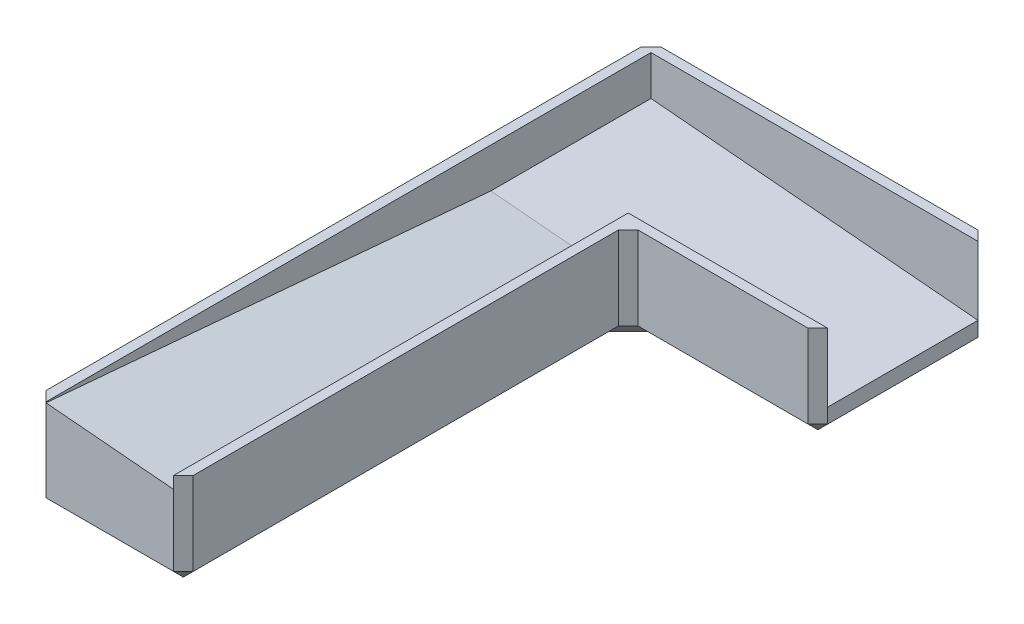
ISO-10303-21;
HEADER;
FILE_DESCRIPTION(('STEP AP214'),'2;1');
FILE_NAME('part.step','',(''),(''),'','','');
FILE_SCHEMA(('AUTOMOTIVE_DESIGN { 1 0 10303 214 1 1 1 1 }'));
ENDSEC;
DATA;
#1=APPLICATION_CONTEXT('core data for automotive mechanical design processes');
#2=APPLICATION_PROTOCOL_DEFINITION('international standard','automotive_design',2000,#1);
#3=PRODUCT_CONTEXT('',#1,'mechanical');
#4=PRODUCT('Part','Part','',(#3));
#5=PRODUCT_RELATED_PRODUCT_CATEGORY('part','',(#4));
#6=PRODUCT_DEFINITION_FORMATION('','',#4);
#7=PRODUCT_DEFINITION_CONTEXT('part definition',#1,'design');
#8=PRODUCT_DEFINITION('design','',#6,#7);
#9=PRODUCT_DEFINITION_SHAPE('','',#8);
#10=(LENGTH_UNIT() NAMED_UNIT(*) SI_UNIT(.MILLI.,.METRE.));
#11=(NAMED_UNIT(*) PLANE_ANGLE_UNIT() SI_UNIT($,.RADIAN.));
#12=(NAMED_UNIT(*) SI_UNIT($,.STERADIAN.) SOLID_ANGLE_UNIT());
#13=UNCERTAINTY_MEASURE_WITH_UNIT(LENGTH_MEASURE(1.E-05),#10,'distance_accuracy_value','');
#14=(GEOMETRIC_REPRESENTATION_CONTEXT(3) GLOBAL_UNCERTAINTY_ASSIGNED_CONTEXT((#13)) GLOBAL_UNIT_ASSIGNED_CONTEXT((#10,
#11,#12)) REPRESENTATION_CONTEXT('',''));
#15=CARTESIAN_POINT('',(0.,0.,0.));
#16=DIRECTION('',(0.,0.,1.));
#17=DIRECTION('',(1.,0.,0.));
#18=AXIS2_PLACEMENT_3D('',#15,#16,#17);
#19=CARTESIAN_POINT('',(-0.874258781512864,-25.,0.));
#20=DIRECTION('',(1.,0.,0.));
#21=DIRECTION('',(0.,0.,-1.));
#22=AXIS2_PLACEMENT_3D('',#19,#20,#21);
#23=PLANE('',#22);
#24=DIRECTION('',(0.,0.,1.));
#25=VECTOR('',#24,1.);
#26=CARTESIAN_POINT('',(-0.874258781512545,-6.06088532495046,62.6555080756908));
#27=LINE('',#26,#25);
#28=CARTESIAN_POINT('',(-0.874258781512857,-6.06088532495046,-26.0144919243134));
#29=VERTEX_POINT('',#28);
#30=CARTESIAN_POINT('',(-0.874258781512552,-6.06088532495046,60.6555080756908));
#31=VERTEX_POINT('',#30);
#32=EDGE_CURVE('E251',#29,#31,#27,.T.);
#33=ORIENTED_EDGE('',*,*,#32,.T.);
#34=DIRECTION('',(0.,-1.,0.));
#35=VECTOR('',#34,1.);
#36=CARTESIAN_POINT('',(-0.874258781512864,-25.,60.6555080756908));
#37=LINE('',#36,#35);
#38=CARTESIAN_POINT('',(-0.874258781512864,-23.,60.6555080756908));
#39=VERTEX_POINT('',#38);
#40=EDGE_CURVE('E377',#31,#39,#37,.T.);
#41=ORIENTED_EDGE('',*,*,#40,.T.);
#42=DIRECTION('',(0.,0.,-1.));
#43=VECTOR('',#42,1.);
#44=CARTESIAN_POINT('',(-0.874258781512864,-23.,-28.0144919243134));
#45=LINE('',#44,#43);
#46=CARTESIAN_POINT('',(-0.874258781512864,-23.,-26.0144919243134));
#47=VERTEX_POINT('',#46);
#48=EDGE_CURVE('E371',#39,#47,#45,.T.);
#49=ORIENTED_EDGE('',*,*,#48,.T.);
#50=DIRECTION('',(0.,1.,0.));
#51=VECTOR('',#50,1.);
#52=CARTESIAN_POINT('',(-0.874258781512864,-6.06088532495046,-26.0144919243134));
#53=LINE('',#52,#51);
#54=EDGE_CURVE('E374',#47,#29,#53,.T.);
#55=ORIENTED_EDGE('',*,*,#54,.T.);
#56=EDGE_LOOP('',(#33,#41,#49,#55));
#57=FACE_BOUND('',#56,.T.);
#58=ADVANCED_FACE('F49',(#57),#23,.T.);
#59=CARTESIAN_POINT('',(2.31871958950731E-13,-25.,62.6555080756908));
#60=DIRECTION('',(0.,0.,1.));
#61=DIRECTION('',(1.,0.,0.));
#62=AXIS2_PLACEMENT_3D('',#59,#60,#61);
#63=PLANE('',#62);
#64=DIRECTION('',(-0.996194698091746,0.0871557427476577,0.));
#65=VECTOR('',#64,1.);
#66=CARTESIAN_POINT('',(-1.10343665485622,-8.66549476487964,62.6555080756908));
#67=LINE('',#66,#65);
#68=CARTESIAN_POINT('',(-2.87425878151254,-8.51056790367633,62.6555080756909));
#69=VERTEX_POINT('',#68);
#70=CARTESIAN_POINT('',(-28.8742587815125,-6.23586265200233,62.6555080756909));
#71=VERTEX_POINT('',#70);
#72=EDGE_CURVE('E292',#69,#71,#67,.T.);
#73=ORIENTED_EDGE('',*,*,#72,.T.);
#74=DIRECTION('',(0.,-1.,0.));
#75=VECTOR('',#74,1.);
#76=CARTESIAN_POINT('',(-28.8742587815129,-25.,62.6555080756909));
#77=LINE('',#76,#75);
#78=CARTESIAN_POINT('',(-28.8742587815129,-23.,62.6555080756909));
#79=VERTEX_POINT('',#78);
#80=EDGE_CURVE('E368',#71,#79,#77,.T.);
#81=ORIENTED_EDGE('',*,*,#80,.T.);
#82=DIRECTION('',(1.,0.,0.));
#83=VECTOR('',#82,1.);
#84=CARTESIAN_POINT('',(-0.874258781512545,-23.,62.6555080756908));
#85=LINE('',#84,#83);
#86=CARTESIAN_POINT('',(-2.87425878151287,-23.,62.6555080756908));
#87=VERTEX_POINT('',#86);
#88=EDGE_CURVE('E362',#79,#87,#85,.T.);
#89=ORIENTED_EDGE('',*,*,#88,.T.);
#90=DIRECTION('',(0.,1.,0.));
#91=VECTOR('',#90,1.);
#92=CARTESIAN_POINT('',(-2.87425878151287,-25.,62.6555080756908));
#93=LINE('',#92,#91);
#94=EDGE_CURVE('E365',#87,#69,#93,.T.);
#95=ORIENTED_EDGE('',*,*,#94,.T.);
#96=EDGE_LOOP('',(#73,#81,#89,#95));
#97=FACE_BOUND('',#96,.T.);
#98=ADVANCED_FACE('F562',(#97),#63,.T.);
#99=CARTESIAN_POINT('',(-30.8742587815129,-25.,0.));
#100=DIRECTION('',(1.,0.,0.));
#101=DIRECTION('',(0.,0.,-1.));
#102=AXIS2_PLACEMENT_3D('',#99,#100,#101);
#103=PLANE('',#102);
#104=DIRECTION('',(0.,0.,-1.));
#105=VECTOR('',#104,1.);
#106=CARTESIAN_POINT('',(-30.8742587815129,-6.06088532495046,-62.655508075691));
#107=LINE('',#106,#105);
#108=CARTESIAN_POINT('',(-30.8742587815126,-6.06088532495046,60.6555080756909));
#109=VERTEX_POINT('',#108);
#110=CARTESIAN_POINT('',(-30.8742587815129,-6.06088532495046,-60.655508075691));
#111=VERTEX_POINT('',#110);
#112=EDGE_CURVE('E268',#109,#111,#107,.T.);
#113=ORIENTED_EDGE('',*,*,#112,.T.);
#114=DIRECTION('',(0.,-1.,0.));
#115=VECTOR('',#114,1.);
#116=CARTESIAN_POINT('',(-30.8742587815129,-25.,-60.655508075691));
#117=LINE('',#116,#115);
#118=CARTESIAN_POINT('',(-30.8742587815129,-23.,-60.655508075691));
#119=VERTEX_POINT('',#118);
#120=EDGE_CURVE('E359',#111,#119,#117,.T.);
#121=ORIENTED_EDGE('',*,*,#120,.T.);
#122=DIRECTION('',(0.,0.,1.));
#123=VECTOR('',#122,1.);
#124=CARTESIAN_POINT('',(-30.8742587815129,-23.,0.));
#125=LINE('',#124,#123);
#126=CARTESIAN_POINT('',(-30.8742587815129,-23.,60.6555080756909));
#127=VERTEX_POINT('',#126);
#128=EDGE_CURVE('E353',#119,#127,#125,.T.);
#129=ORIENTED_EDGE('',*,*,#128,.T.);
#130=DIRECTION('',(0.,1.,0.));
#131=VECTOR('',#130,1.);
#132=CARTESIAN_POINT('',(-30.8742587815129,-6.06088532495046,60.6555080756909));
#133=LINE('',#132,#131);
#134=EDGE_CURVE('E356',#127,#109,#133,.T.);
#135=ORIENTED_EDGE('',*,*,#134,.T.);
#136=EDGE_LOOP('',(#113,#121,#129,#135));
#137=FACE_BOUND('',#136,.T.);
#138=ADVANCED_FACE('F568',(#137),#103,.F.);
#139=CARTESIAN_POINT('',(0.,-25.,-62.655508075691));
#140=DIRECTION('',(0.,0.,-1.));
#141=DIRECTION('',(-1.,0.,0.));
#142=AXIS2_PLACEMENT_3D('',#139,#140,#141);
#143=PLANE('',#142);
#144=DIRECTION('',(1.,0.,0.));
#145=VECTOR('',#144,1.);
#146=CARTESIAN_POINT('',(37.7805510084871,-6.06088532495046,-62.655508075691));
#147=LINE('',#146,#145);
#148=CARTESIAN_POINT('',(-28.8742587815129,-6.06088532495046,-62.655508075691));
#149=VERTEX_POINT('',#148);
#150=CARTESIAN_POINT('',(35.7805510084871,-6.06088532495046,-62.655508075691));
#151=VERTEX_POINT('',#150);
#152=EDGE_CURVE('E272',#149,#151,#147,.T.);
#153=ORIENTED_EDGE('',*,*,#152,.T.);
#154=DIRECTION('',(0.,-1.,0.));
#155=VECTOR('',#154,1.);
#156=CARTESIAN_POINT('',(35.7805510084871,-25.,-62.655508075691));
#157=LINE('',#156,#155);
#158=CARTESIAN_POINT('',(35.7805510084871,-23.,-62.655508075691));
#159=VERTEX_POINT('',#158);
#160=EDGE_CURVE('E350',#151,#159,#157,.T.);
#161=ORIENTED_EDGE('',*,*,#160,.T.);
#162=DIRECTION('',(-1.,0.,0.));
#163=VECTOR('',#162,1.);
#164=CARTESIAN_POINT('',(-30.8742587815129,-23.,-62.655508075691));
#165=LINE('',#164,#163);
#166=CARTESIAN_POINT('',(-28.8742587815129,-23.,-62.655508075691));
#167=VERTEX_POINT('',#166);
#168=EDGE_CURVE('E344',#159,#167,#165,.T.);
#169=ORIENTED_EDGE('',*,*,#168,.T.);
#170=DIRECTION('',(0.,1.,0.));
#171=VECTOR('',#170,1.);
#172=CARTESIAN_POINT('',(-28.8742587815129,-6.06088532495046,-62.655508075691));
#173=LINE('',#172,#171);
#174=EDGE_CURVE('E347',#167,#149,#173,.T.);
#175=ORIENTED_EDGE('',*,*,#174,.T.);
#176=EDGE_LOOP('',(#153,#161,#169,#175));
#177=FACE_BOUND('',#176,.T.);
#178=ADVANCED_FACE('F711',(#177),#143,.T.);
#179=CARTESIAN_POINT('',(37.7805510084871,-25.,0.));
#180=DIRECTION('',(1.,0.,0.));
#181=DIRECTION('',(0.,0.,-1.));
#182=AXIS2_PLACEMENT_3D('',#179,#180,#181);
#183=PLANE('',#182);
#184=DIRECTION('',(0.,0.,1.));
#185=VECTOR('',#184,1.);
#186=CARTESIAN_POINT('',(37.7805510084871,-20.,-80.0144919243134));
#187=LINE('',#186,#185);
#188=CARTESIAN_POINT('',(37.7805510084871,-20.,-60.655508075691));
#189=VERTEX_POINT('',#188);
#190=CARTESIAN_POINT('',(37.7805510084871,-20.,-30.0144919243134));
#191=VERTEX_POINT('',#190);
#192=EDGE_CURVE('E298',#189,#191,#187,.T.);
#193=ORIENTED_EDGE('',*,*,#192,.T.);
#194=DIRECTION('',(0.,-1.,0.));
#195=VECTOR('',#194,1.);
#196=CARTESIAN_POINT('',(37.7805510084871,-25.,-30.0144919243135));
#197=LINE('',#196,#195);
#198=CARTESIAN_POINT('',(37.7805510084871,-23.,-30.0144919243135));
#199=VERTEX_POINT('',#198);
#200=EDGE_CURVE('E237',#191,#199,#197,.T.);
#201=ORIENTED_EDGE('',*,*,#200,.T.);
#202=DIRECTION('',(0.,0.,-1.));
#203=VECTOR('',#202,1.);
#204=CARTESIAN_POINT('',(37.7805510084871,-23.,-62.655508075691));
#205=LINE('',#204,#203);
#206=CARTESIAN_POINT('',(37.7805510084871,-23.,-60.655508075691));
#207=VERTEX_POINT('',#206);
#208=EDGE_CURVE('E220',#199,#207,#205,.T.);
#209=ORIENTED_EDGE('',*,*,#208,.T.);
#210=DIRECTION('',(0.,1.,0.));
#211=VECTOR('',#210,1.);
#212=CARTESIAN_POINT('',(37.7805510084871,-25.,-60.655508075691));
#213=LINE('',#212,#211);
#214=EDGE_CURVE('E330',#207,#189,#213,.T.);
#215=ORIENTED_EDGE('',*,*,#214,.T.);
#216=EDGE_LOOP('',(#193,#201,#209,#215));
#217=FACE_BOUND('',#216,.T.);
#218=ADVANCED_FACE('F558',(#217),#183,.T.);
#219=CARTESIAN_POINT('',(0.,-25.,-28.0144919243134));
#220=DIRECTION('',(0.,0.,1.));
#221=DIRECTION('',(1.,0.,0.));
#222=AXIS2_PLACEMENT_3D('',#219,#220,#221);
#223=PLANE('',#222);
#224=DIRECTION('',(1.,0.,0.));
#225=VECTOR('',#224,1.);
#226=CARTESIAN_POINT('',(37.7805510084871,-23.,-28.0144919243134));
#227=LINE('',#226,#225);
#228=CARTESIAN_POINT('',(1.12574121848715,-23.,-28.0144919243134));
#229=VERTEX_POINT('',#228);
#230=CARTESIAN_POINT('',(35.7805510084871,-23.,-28.0144919243134));
#231=VERTEX_POINT('',#230);
#232=EDGE_CURVE('E317',#229,#231,#227,.T.);
#233=ORIENTED_EDGE('',*,*,#232,.T.);
#234=DIRECTION('',(0.,1.,0.));
#235=VECTOR('',#234,1.);
#236=CARTESIAN_POINT('',(35.7805510084871,-25.,-28.0144919243134));
#237=LINE('',#236,#235);
#238=CARTESIAN_POINT('',(35.7805510084871,-6.06088532495046,-28.0144919243134));
#239=VERTEX_POINT('',#238);
#240=EDGE_CURVE('E323',#231,#239,#237,.T.);
#241=ORIENTED_EDGE('',*,*,#240,.T.);
#242=DIRECTION('',(-1.,0.,0.));
#243=VECTOR('',#242,1.);
#244=CARTESIAN_POINT('',(-0.874258781512864,-6.06088532495046,-28.0144919243134));
#245=LINE('',#244,#243);
#246=CARTESIAN_POINT('',(1.12574121848715,-6.06088532495046,-28.0144919243134));
#247=VERTEX_POINT('',#246);
#248=EDGE_CURVE('E214',#239,#247,#245,.T.);
#249=ORIENTED_EDGE('',*,*,#248,.T.);
#250=DIRECTION('',(0.,-1.,0.));
#251=VECTOR('',#250,1.);
#252=CARTESIAN_POINT('',(1.12574121848715,-25.,-28.0144919243134));
#253=LINE('',#252,#251);
#254=EDGE_CURVE('E320',#247,#229,#253,.T.);
#255=ORIENTED_EDGE('',*,*,#254,.T.);
#256=EDGE_LOOP('',(#233,#241,#249,#255));
#257=FACE_BOUND('',#256,.T.);
#258=ADVANCED_FACE('F532',(#257),#223,.T.);
#259=CARTESIAN_POINT('',(0.,-25.,0.));
#260=DIRECTION('',(0.,1.,0.));
#261=DIRECTION('',(0.,0.,1.));
#262=AXIS2_PLACEMENT_3D('',#259,#260,#261);
#263=PLANE('',#262);
#264=CARTESIAN_POINT('',(-23.3742587815125,-25.,52.6555080756909));
#265=DIRECTION('',(0.,-1.,0.));
#266=DIRECTION('',(0.,0.,-1.));
#267=AXIS2_PLACEMENT_3D('',#264,#265,#266);
#268=CIRCLE('',#267,6.45);
#269=CARTESIAN_POINT('',(-28.8742587815129,-25.,49.2861609579251));
#270=VERTEX_POINT('',#269);
#271=CARTESIAN_POINT('',(-28.8742587815129,-25.,56.0248551934567));
#272=VERTEX_POINT('',#271);
#273=EDGE_CURVE('E245',#270,#272,#268,.T.);
#274=ORIENTED_EDGE('',*,*,#273,.F.);
#275=DIRECTION('',(0.,0.,-1.));
#276=VECTOR('',#275,1.);
#277=CARTESIAN_POINT('',(-28.8742587815128,-25.,0.));
#278=LINE('',#277,#276);
#279=CARTESIAN_POINT('',(-28.8742587815128,-25.,-60.655508075691));
#280=VERTEX_POINT('',#279);
#281=EDGE_CURVE('E68',#270,#280,#278,.T.);
#282=ORIENTED_EDGE('',*,*,#281,.T.);
#283=DIRECTION('',(1.,0.,0.));
#284=VECTOR('',#283,1.);
#285=CARTESIAN_POINT('',(37.7805510084871,-25.,-60.655508075691));
#286=LINE('',#285,#284);
#287=CARTESIAN_POINT('',(35.7805510084871,-25.,-60.655508075691));
#288=VERTEX_POINT('',#287);
#289=EDGE_CURVE('E73',#280,#288,#286,.T.);
#290=ORIENTED_EDGE('',*,*,#289,.T.);
#291=DIRECTION('',(0.,0.,1.));
#292=VECTOR('',#291,1.);
#293=CARTESIAN_POINT('',(35.7805510084871,-25.,-28.0144919243134));
#294=LINE('',#293,#292);
#295=CARTESIAN_POINT('',(35.7805510084871,-25.,-30.0144919243135));
#296=VERTEX_POINT('',#295);
#297=EDGE_CURVE('E403',#288,#296,#294,.T.);
#298=ORIENTED_EDGE('',*,*,#297,.T.);
#299=DIRECTION('',(-1.,0.,0.));
#300=VECTOR('',#299,1.);
#301=CARTESIAN_POINT('',(-0.874258781512864,-25.,-30.0144919243135));
#302=LINE('',#301,#300);
#303=CARTESIAN_POINT('',(1.12574121848715,-25.,-30.0144919243135));
#304=VERTEX_POINT('',#303);
#305=EDGE_CURVE('E400',#296,#304,#302,.T.);
#306=ORIENTED_EDGE('',*,*,#305,.T.);
#307=DIRECTION('',(0.70710678118655,0.,-0.707106781186545));
#308=VECTOR('',#307,1.);
#309=CARTESIAN_POINT('',(1.12574121848715,-25.,-30.0144919243135));
#310=LINE('',#309,#308);
#311=CARTESIAN_POINT('',(-0.874258781512864,-25.,-28.0144919243134));
#312=VERTEX_POINT('',#311);
#313=EDGE_CURVE('E396',#312,#304,#310,.T.);
#314=ORIENTED_EDGE('',*,*,#313,.F.);
#315=DIRECTION('',(0.70710678118655,0.,-0.707106781186545));
#316=VECTOR('',#315,1.);
#317=CARTESIAN_POINT('',(1.12574121848715,-25.,-30.0144919243135));
#318=LINE('',#317,#316);
#319=CARTESIAN_POINT('',(-2.87425878151288,-25.,-26.0144919243134));
#320=VERTEX_POINT('',#319);
#321=EDGE_CURVE('E392',#320,#312,#318,.T.);
#322=ORIENTED_EDGE('',*,*,#321,.F.);
#323=DIRECTION('',(0.,0.,1.));
#324=VECTOR('',#323,1.);
#325=CARTESIAN_POINT('',(-2.87425878151288,-25.,62.6555080756908));
#326=LINE('',#325,#324);
#327=CARTESIAN_POINT('',(-2.87425878151288,-25.,49.2861609579241));
#328=VERTEX_POINT('',#327);
#329=EDGE_CURVE('E389',#320,#328,#326,.T.);
#330=ORIENTED_EDGE('',*,*,#329,.T.);
#331=CARTESIAN_POINT('',(-8.37425878151254,-25.,52.6555080756909));
#332=DIRECTION('',(0.,-1.,0.));
#333=DIRECTION('',(0.,0.,-1.));
#334=AXIS2_PLACEMENT_3D('',#331,#332,#333);
#335=CIRCLE('',#334,6.44999999999999);
#336=CARTESIAN_POINT('',(-2.87425878151288,-25.,56.0248551934577));
#337=VERTEX_POINT('',#336);
#338=EDGE_CURVE('E491',#337,#328,#335,.T.);
#339=ORIENTED_EDGE('',*,*,#338,.F.);
#340=DIRECTION('',(0.,0.,1.));
#341=VECTOR('',#340,1.);
#342=CARTESIAN_POINT('',(-2.87425878151288,-25.,62.6555080756908));
#343=LINE('',#342,#341);
#344=CARTESIAN_POINT('',(-2.87425878151288,-25.,60.6555080756908));
#345=VERTEX_POINT('',#344);
#346=EDGE_CURVE('E380',#337,#345,#343,.T.);
#347=ORIENTED_EDGE('',*,*,#346,.T.);
#348=DIRECTION('',(-1.,0.,0.));
#349=VECTOR('',#348,1.);
#350=CARTESIAN_POINT('',(-30.8742587815126,-25.,60.6555080756909));
#351=LINE('',#350,#349);
#352=CARTESIAN_POINT('',(-28.8742587815129,-25.,60.6555080756909));
#353=VERTEX_POINT('',#352);
#354=EDGE_CURVE('E383',#345,#353,#351,.T.);
#355=ORIENTED_EDGE('',*,*,#354,.T.);
#356=DIRECTION('',(0.,0.,-1.));
#357=VECTOR('',#356,1.);
#358=CARTESIAN_POINT('',(-28.8742587815128,-25.,0.));
#359=LINE('',#358,#357);
#360=EDGE_CURVE('E386',#353,#272,#359,.T.);
#361=ORIENTED_EDGE('',*,*,#360,.T.);
#362=EDGE_LOOP('',(#274,#282,#290,#298,#306,#314,#322,#330,#339,#347,#355,#361));
#363=FACE_BOUND('',#362,.T.);
#364=ADVANCED_FACE('F546',(#363),#263,.F.);
#365=CARTESIAN_POINT('',(-1.4494960455414,-16.5678156131839,-80.0144919243134));
#366=DIRECTION('',(0.0871557427476582,0.996194698091746,0.));
#367=DIRECTION('',(-0.996194698091746,0.0871557427476582,0.));
#368=AXIS2_PLACEMENT_3D('',#365,#366,#367);
#369=PLANE('',#368);
#370=DIRECTION('',(-0.996194698091746,0.0871557427476582,0.));
#371=VECTOR('',#370,1.);
#372=CARTESIAN_POINT('',(-1.4494960455414,-16.5678156131839,-30.0144919243134));
#373=LINE('',#372,#371);
#374=CARTESIAN_POINT('',(-2.87425878151253,-16.4431650255723,-30.0144919243134));
#375=VERTEX_POINT('',#374);
#376=EDGE_CURVE('E314',#191,#375,#373,.T.);
#377=ORIENTED_EDGE('',*,*,#376,.F.);
#378=ORIENTED_EDGE('',*,*,#192,.F.);
#379=DIRECTION('',(0.996194698091746,-0.0871557427476582,0.));
#380=VECTOR('',#379,1.);
#381=CARTESIAN_POINT('',(-1.4494960455414,-16.5678156131839,-60.655508075691));
#382=LINE('',#381,#380);
#383=CARTESIAN_POINT('',(-28.8742587815125,-14.1684597738982,-60.655508075691));
#384=VERTEX_POINT('',#383);
#385=EDGE_CURVE('E306',#384,#189,#382,.T.);
#386=ORIENTED_EDGE('',*,*,#385,.F.);
#387=DIRECTION('',(0.,0.,-1.));
#388=VECTOR('',#387,1.);
#389=CARTESIAN_POINT('',(-28.8742587815125,-14.1684597738982,-80.0144919243134));
#390=LINE('',#389,#388);
#391=CARTESIAN_POINT('',(-28.8742587815125,-14.1684597738983,-28.0144919243134));
#392=VERTEX_POINT('',#391);
#393=EDGE_CURVE('E281',#392,#384,#390,.T.);
#394=ORIENTED_EDGE('',*,*,#393,.F.);
#395=DIRECTION('',(-0.996194698091746,0.0871557427476582,0.));
#396=VECTOR('',#395,1.);
#397=CARTESIAN_POINT('',(-1.4494960455414,-16.5678156131839,-28.0144919243134));
#398=LINE('',#397,#396);
#399=CARTESIAN_POINT('',(-2.87425878151253,-16.4431650255723,-28.0144919243134));
#400=VERTEX_POINT('',#399);
#401=EDGE_CURVE('E295',#400,#392,#398,.T.);
#402=ORIENTED_EDGE('',*,*,#401,.F.);
#403=DIRECTION('',(0.,0.,1.));
#404=VECTOR('',#403,1.);
#405=CARTESIAN_POINT('',(-2.87425878151253,-16.4431650255723,-80.0144919243134));
#406=LINE('',#405,#404);
#407=EDGE_CURVE('E257',#375,#400,#406,.T.);
#408=ORIENTED_EDGE('',*,*,#407,.F.);
#409=EDGE_LOOP('',(#377,#378,#386,#394,#402,#408));
#410=FACE_BOUND('',#409,.T.);
#411=ADVANCED_FACE('F549',(#410),#369,.T.);
#412=CARTESIAN_POINT('',(-0.874258781512864,-19.2377706566478,-57.9569804530977));
#413=DIRECTION('',(0.0868265938642468,0.992432509138967,-0.086826593864248));
#414=DIRECTION('',(0.,0.0871557427476586,0.996194698091746));
#415=AXIS2_PLACEMENT_3D('',#412,#413,#414);
#416=PLANE('',#415);
#417=DIRECTION('',(0.,0.0871557427476586,0.996194698091746));
#418=VECTOR('',#417,1.);
#419=CARTESIAN_POINT('',(-2.87425878151253,-19.0641224789809,-57.9721727000855));
#420=LINE('',#419,#418);
#421=EDGE_CURVE('E310',#400,#69,#420,.T.);
#422=ORIENTED_EDGE('',*,*,#421,.F.);
#423=ORIENTED_EDGE('',*,*,#401,.T.);
#424=DIRECTION('',(0.,-0.0871557427476586,-0.996194698091746));
#425=VECTOR('',#424,1.);
#426=CARTESIAN_POINT('',(-28.8742587815125,-16.8066961693108,-58.1696719109268));
#427=LINE('',#426,#425);
#428=EDGE_CURVE('E302',#71,#392,#427,.T.);
#429=ORIENTED_EDGE('',*,*,#428,.F.);
#430=ORIENTED_EDGE('',*,*,#72,.F.);
#431=EDGE_LOOP('',(#422,#423,#429,#430));
#432=FACE_BOUND('',#431,.T.);
#433=ADVANCED_FACE('F555',(#432),#416,.T.);
#434=CARTESIAN_POINT('',(-28.8742587815125,-6.06088532495046,62.6555080756909));
#435=DIRECTION('',(1.,0.,0.));
#436=DIRECTION('',(0.,0.,-1.));
#437=AXIS2_PLACEMENT_3D('',#434,#435,#436);
#438=PLANE('',#437);
#439=ORIENTED_EDGE('',*,*,#428,.T.);
#440=ORIENTED_EDGE('',*,*,#393,.T.);
#441=DIRECTION('',(0.,-1.,0.));
#442=VECTOR('',#441,1.);
#443=CARTESIAN_POINT('',(-28.8742587815125,-6.06088532495046,-60.655508075691));
#444=LINE('',#443,#442);
#445=CARTESIAN_POINT('',(-28.8742587815125,-6.06088532495046,-60.655508075691));
#446=VERTEX_POINT('',#445);
#447=EDGE_CURVE('E282',#446,#384,#444,.T.);
#448=ORIENTED_EDGE('',*,*,#447,.F.);
#449=DIRECTION('',(0.,0.,1.));
#450=VECTOR('',#449,1.);
#451=CARTESIAN_POINT('',(-28.8742587815125,-6.06088532495046,62.6555080756909));
#452=LINE('',#451,#450);
#453=CARTESIAN_POINT('',(-28.8742587815125,-6.06088532495046,62.6555080756909));
#454=VERTEX_POINT('',#453);
#455=EDGE_CURVE('E264',#446,#454,#452,.T.);
#456=ORIENTED_EDGE('',*,*,#455,.T.);
#457=DIRECTION('',(0.,-1.,0.));
#458=VECTOR('',#457,1.);
#459=CARTESIAN_POINT('',(-28.8742587815125,-6.06088532495046,62.6555080756909));
#460=LINE('',#459,#458);
#461=EDGE_CURVE('E277',#454,#71,#460,.T.);
#462=ORIENTED_EDGE('',*,*,#461,.T.);
#463=EDGE_LOOP('',(#439,#440,#448,#456,#462));
#464=FACE_BOUND('',#463,.T.);
#465=ADVANCED_FACE('F709',(#464),#438,.T.);
#466=CARTESIAN_POINT('',(-28.8742587815125,-6.06088532495046,-60.655508075691));
#467=DIRECTION('',(0.,0.,1.));
#468=DIRECTION('',(1.,0.,0.));
#469=AXIS2_PLACEMENT_3D('',#466,#467,#468);
#470=PLANE('',#469);
#471=ORIENTED_EDGE('',*,*,#447,.T.);
#472=ORIENTED_EDGE('',*,*,#385,.T.);
#473=DIRECTION('',(0.,-1.,0.));
#474=VECTOR('',#473,1.);
#475=CARTESIAN_POINT('',(37.7805510084871,-6.06088532495046,-60.655508075691));
#476=LINE('',#475,#474);
#477=CARTESIAN_POINT('',(37.7805510084871,-6.06088532495046,-60.655508075691));
#478=VERTEX_POINT('',#477);
#479=EDGE_CURVE('E276',#478,#189,#476,.T.);
#480=ORIENTED_EDGE('',*,*,#479,.F.);
#481=DIRECTION('',(-1.,0.,0.));
#482=VECTOR('',#481,1.);
#483=CARTESIAN_POINT('',(-28.8742587815125,-6.06088532495046,-60.655508075691));
#484=LINE('',#483,#482);
#485=EDGE_CURVE('E260',#478,#446,#484,.T.);
#486=ORIENTED_EDGE('',*,*,#485,.T.);
#487=EDGE_LOOP('',(#471,#472,#480,#486));
#488=FACE_BOUND('',#487,.T.);
#489=ADVANCED_FACE('F707',(#488),#470,.T.);
#490=CARTESIAN_POINT('',(0.,-6.06088532495046,0.));
#491=DIRECTION('',(0.,1.,0.));
#492=DIRECTION('',(0.,0.,1.));
#493=AXIS2_PLACEMENT_3D('',#490,#491,#492);
#494=PLANE('',#493);
#495=ORIENTED_EDGE('',*,*,#485,.F.);
#496=DIRECTION('',(0.70710678118655,0.,0.707106781186545));
#497=VECTOR('',#496,1.);
#498=CARTESIAN_POINT('',(49.2180295420889,-6.06088532495046,-49.2180295420893));
#499=LINE('',#498,#497);
#500=EDGE_CURVE('E341',#478,#151,#499,.F.);
#501=ORIENTED_EDGE('',*,*,#500,.T.);
#502=ORIENTED_EDGE('',*,*,#152,.F.);
#503=DIRECTION('',(-0.707106781186545,0.,0.70710678118655));
#504=VECTOR('',#503,1.);
#505=CARTESIAN_POINT('',(-45.764883428602,-6.06088532495046,-45.7648834286017));
#506=LINE('',#505,#504);
#507=EDGE_CURVE('E338',#149,#111,#506,.T.);
#508=ORIENTED_EDGE('',*,*,#507,.T.);
#509=ORIENTED_EDGE('',*,*,#112,.F.);
#510=DIRECTION('',(0.70710678118655,0.,0.707106781186545));
#511=VECTOR('',#510,1.);
#512=CARTESIAN_POINT('',(-45.7648834286018,-6.06088532495046,45.7648834286021));
#513=LINE('',#512,#511);
#514=EDGE_CURVE('E335',#109,#454,#513,.T.);
#515=ORIENTED_EDGE('',*,*,#514,.T.);
#516=ORIENTED_EDGE('',*,*,#455,.F.);
#517=EDGE_LOOP('',(#495,#501,#502,#508,#509,#515,#516));
#518=FACE_BOUND('',#517,.T.);
#519=ADVANCED_FACE('F688',(#518),#494,.T.);
#520=CARTESIAN_POINT('',(37.7805510084871,-6.06088532495046,-30.0144919243134));
#521=DIRECTION('',(0.,0.,-1.));
#522=DIRECTION('',(-1.,0.,0.));
#523=AXIS2_PLACEMENT_3D('',#520,#521,#522);
#524=PLANE('',#523);
#525=DIRECTION('',(0.,-1.,0.));
#526=VECTOR('',#525,1.);
#527=CARTESIAN_POINT('',(37.7805510084871,-6.06088532495046,-30.0144919243134));
#528=LINE('',#527,#526);
#529=CARTESIAN_POINT('',(37.7805510084871,-6.06088532495046,-30.0144919243134));
#530=VERTEX_POINT('',#529);
#531=EDGE_CURVE('E225',#530,#191,#528,.T.);
#532=ORIENTED_EDGE('',*,*,#531,.T.);
#533=ORIENTED_EDGE('',*,*,#376,.T.);
#534=DIRECTION('',(0.,-1.,0.));
#535=VECTOR('',#534,1.);
#536=CARTESIAN_POINT('',(-2.87425878151253,-6.06088532495046,-30.0144919243134));
#537=LINE('',#536,#535);
#538=CARTESIAN_POINT('',(-2.87425878151253,-6.06088532495046,-30.0144919243134));
#539=VERTEX_POINT('',#538);
#540=EDGE_CURVE('E228',#539,#375,#537,.T.);
#541=ORIENTED_EDGE('',*,*,#540,.F.);
#542=DIRECTION('',(1.,0.,0.));
#543=VECTOR('',#542,1.);
#544=CARTESIAN_POINT('',(37.7805510084871,-6.06088532495046,-30.0144919243134));
#545=LINE('',#544,#543);
#546=EDGE_CURVE('E212',#539,#530,#545,.T.);
#547=ORIENTED_EDGE('',*,*,#546,.T.);
#548=EDGE_LOOP('',(#532,#533,#541,#547));
#549=FACE_BOUND('',#548,.T.);
#550=ADVANCED_FACE('F224',(#549),#524,.T.);
#551=CARTESIAN_POINT('',(-2.87425878151254,-6.06088532495046,62.6555080756909));
#552=DIRECTION('',(-1.,0.,0.));
#553=DIRECTION('',(0.,0.,1.));
#554=AXIS2_PLACEMENT_3D('',#551,#552,#553);
#555=PLANE('',#554);
#556=ORIENTED_EDGE('',*,*,#540,.T.);
#557=ORIENTED_EDGE('',*,*,#407,.T.);
#558=ORIENTED_EDGE('',*,*,#421,.T.);
#559=DIRECTION('',(0.,-1.,0.));
#560=VECTOR('',#559,1.);
#561=CARTESIAN_POINT('',(-2.87425878151254,-6.06088532495046,62.6555080756909));
#562=LINE('',#561,#560);
#563=CARTESIAN_POINT('',(-2.87425878151254,-6.06088532495046,62.6555080756909));
#564=VERTEX_POINT('',#563);
#565=EDGE_CURVE('E232',#564,#69,#562,.T.);
#566=ORIENTED_EDGE('',*,*,#565,.F.);
#567=DIRECTION('',(0.,0.,-1.));
#568=VECTOR('',#567,1.);
#569=CARTESIAN_POINT('',(-2.87425878151254,-6.06088532495046,62.6555080756909));
#570=LINE('',#569,#568);
#571=EDGE_CURVE('E231',#564,#539,#570,.T.);
#572=ORIENTED_EDGE('',*,*,#571,.T.);
#573=EDGE_LOOP('',(#556,#557,#558,#566,#572));
#574=FACE_BOUND('',#573,.T.);
#575=ADVANCED_FACE('F509',(#574),#555,.T.);
#576=CARTESIAN_POINT('',(0.,-6.06088532495046,0.));
#577=DIRECTION('',(0.,1.,0.));
#578=DIRECTION('',(0.,0.,1.));
#579=AXIS2_PLACEMENT_3D('',#576,#577,#578);
#580=PLANE('',#579);
#581=ORIENTED_EDGE('',*,*,#248,.F.);
#582=DIRECTION('',(-0.707106781186545,0.,0.70710678118655));
#583=VECTOR('',#582,1.);
#584=CARTESIAN_POINT('',(3.88302954208697,-6.06088532495046,3.88302954208695));
#585=LINE('',#584,#583);
#586=EDGE_CURVE('E208',#239,#530,#585,.F.);
#587=ORIENTED_EDGE('',*,*,#586,.T.);
#588=ORIENTED_EDGE('',*,*,#546,.F.);
#589=ORIENTED_EDGE('',*,*,#571,.F.);
#590=DIRECTION('',(-0.707106781186549,0.,0.707106781186546));
#591=VECTOR('',#590,1.);
#592=CARTESIAN_POINT('',(29.890624647089,-6.06088532495046,29.8906246470891));
#593=LINE('',#592,#591);
#594=EDGE_CURVE('E221',#564,#31,#593,.F.);
#595=ORIENTED_EDGE('',*,*,#594,.T.);
#596=ORIENTED_EDGE('',*,*,#32,.F.);
#597=DIRECTION('',(-0.70710678118655,0.,0.707106781186545));
#598=VECTOR('',#597,1.);
#599=CARTESIAN_POINT('',(-0.874258781512864,-6.06088532495046,-26.0144919243134));
#600=LINE('',#599,#598);
#601=EDGE_CURVE('E11',#29,#247,#600,.F.);
#602=ORIENTED_EDGE('',*,*,#601,.T.);
#603=EDGE_LOOP('',(#581,#587,#588,#589,#595,#596,#602));
#604=FACE_BOUND('',#603,.T.);
#605=ADVANCED_FACE('F210',(#604),#580,.T.);
#606=CARTESIAN_POINT('',(-8.37425878151254,-10.,52.6555080756909));
#607=DIRECTION('',(0.,-1.,0.));
#608=DIRECTION('',(0.,0.,-1.));
#609=AXIS2_PLACEMENT_3D('',#606,#607,#608);
#610=CYLINDRICAL_SURFACE('',#609,6.44999999999999);
#611=CARTESIAN_POINT('',(-8.37425878151254,-10.,52.6555080756909));
#612=DIRECTION('',(0.,-1.,0.));
#613=DIRECTION('',(0.,0.,-1.));
#614=AXIS2_PLACEMENT_3D('',#611,#612,#613);
#615=CIRCLE('',#614,6.44999999999999);
#616=CARTESIAN_POINT('',(-8.37425878151254,-10.,46.2055080756909));
#617=VERTEX_POINT('',#616);
#618=EDGE_CURVE('E485',#617,#617,#615,.T.);
#619=ORIENTED_EDGE('',*,*,#618,.F.);
#620=EDGE_LOOP('',(#619));
#621=FACE_BOUND('',#620,.T.);
#622=ORIENTED_EDGE('',*,*,#338,.T.);
#623=CARTESIAN_POINT('',(-8.37425878151254,-30.4999999999996,52.6555080756909));
#624=DIRECTION('',(0.707106781186545,-0.70710678118655,0.));
#625=DIRECTION('',(-0.70710678118655,-0.707106781186545,0.));
#626=AXIS2_PLACEMENT_3D('',#623,#624,#625);
#627=ELLIPSE('',#626,9.12167747730642,6.44999999999999);
#628=EDGE_CURVE('E60',#328,#337,#627,.T.);
#629=ORIENTED_EDGE('',*,*,#628,.T.);
#630=EDGE_LOOP('',(#622,#629));
#631=FACE_BOUND('',#630,.T.);
#632=ADVANCED_FACE('F853',(#621,#631),#610,.F.);
#633=CARTESIAN_POINT('',(-8.37425878151254,-10.,52.6555080756909));
#634=DIRECTION('',(0.,-1.,0.));
#635=DIRECTION('',(0.,0.,-1.));
#636=AXIS2_PLACEMENT_3D('',#633,#634,#635);
#637=PLANE('',#636);
#638=ORIENTED_EDGE('',*,*,#618,.T.);
#639=EDGE_LOOP('',(#638));
#640=FACE_BOUND('',#639,.T.);
#641=ADVANCED_FACE('F862',(#640),#637,.T.);
#642=CARTESIAN_POINT('',(-23.3742587815125,-10.,52.6555080756909));
#643=DIRECTION('',(0.,-1.,0.));
#644=DIRECTION('',(0.,0.,-1.));
#645=AXIS2_PLACEMENT_3D('',#642,#643,#644);
#646=CYLINDRICAL_SURFACE('',#645,6.45);
#647=CARTESIAN_POINT('',(-23.3742587815125,-10.,52.6555080756909));
#648=DIRECTION('',(0.,-1.,0.));
#649=DIRECTION('',(0.,0.,-1.));
#650=AXIS2_PLACEMENT_3D('',#647,#648,#649);
#651=CIRCLE('',#650,6.45);
#652=CARTESIAN_POINT('',(-23.3742587815125,-10.,46.2055080756909));
#653=VERTEX_POINT('',#652);
#654=EDGE_CURVE('E239',#653,#653,#651,.T.);
#655=ORIENTED_EDGE('',*,*,#654,.F.);
#656=EDGE_LOOP('',(#655));
#657=FACE_BOUND('',#656,.T.);
#658=ORIENTED_EDGE('',*,*,#273,.T.);
#659=CARTESIAN_POINT('',(-23.3742587815125,-30.5000000000003,52.6555080756909));
#660=DIRECTION('',(0.707106781186545,0.70710678118655,0.));
#661=DIRECTION('',(0.70710678118655,-0.707106781186545,0.));
#662=AXIS2_PLACEMENT_3D('',#659,#660,#661);
#663=ELLIPSE('',#662,9.12167747730644,6.45);
#664=EDGE_CURVE('E410',#272,#270,#663,.F.);
#665=ORIENTED_EDGE('',*,*,#664,.T.);
#666=EDGE_LOOP('',(#658,#665));
#667=FACE_BOUND('',#666,.T.);
#668=ADVANCED_FACE('F873',(#657,#667),#646,.F.);
#669=CARTESIAN_POINT('',(-23.3742587815125,-10.,52.6555080756909));
#670=DIRECTION('',(0.,-1.,0.));
#671=DIRECTION('',(0.,0.,-1.));
#672=AXIS2_PLACEMENT_3D('',#669,#670,#671);
#673=PLANE('',#672);
#674=ORIENTED_EDGE('',*,*,#654,.T.);
#675=EDGE_LOOP('',(#674));
#676=FACE_BOUND('',#675,.T.);
#677=ADVANCED_FACE('F674',(#676),#673,.T.);
#678=CARTESIAN_POINT('',(-30.8742587815129,-25.,60.6555080756909));
#679=DIRECTION('',(-0.707106781186545,0.,0.70710678118655));
#680=DIRECTION('',(0.,-1.,0.));
#681=AXIS2_PLACEMENT_3D('',#678,#679,#680);
#682=PLANE('',#681);
#683=DIRECTION('',(-0.70710678118655,0.,-0.707106781186545));
#684=VECTOR('',#683,1.);
#685=CARTESIAN_POINT('',(-28.8742587815128,-23.,62.6555080756909));
#686=LINE('',#685,#684);
#687=EDGE_CURVE('E54',#79,#127,#686,.T.);
#688=ORIENTED_EDGE('',*,*,#687,.F.);
#689=ORIENTED_EDGE('',*,*,#80,.F.);
#690=ORIENTED_EDGE('',*,*,#461,.F.);
#691=ORIENTED_EDGE('',*,*,#514,.F.);
#692=ORIENTED_EDGE('',*,*,#134,.F.);
#693=EDGE_LOOP('',(#688,#689,#690,#691,#692));
#694=FACE_BOUND('',#693,.T.);
#695=ADVANCED_FACE('F52',(#694),#682,.T.);
#696=CARTESIAN_POINT('',(-28.8742587815129,-23.,62.6555080756909));
#697=DIRECTION('',(-0.577350269189622,-0.57735026918963,0.577350269189625));
#698=DIRECTION('',(0.,-0.707106781186544,-0.707106781186551));
#699=AXIS2_PLACEMENT_3D('',#696,#697,#698);
#700=PLANE('',#699);
#701=DIRECTION('',(0.,0.707106781186545,0.70710678118655));
#702=VECTOR('',#701,1.);
#703=CARTESIAN_POINT('',(-28.8742587815129,-23.,62.6555080756909));
#704=LINE('',#703,#702);
#705=EDGE_CURVE('E473',#79,#353,#704,.F.);
#706=ORIENTED_EDGE('',*,*,#705,.F.);
#707=ORIENTED_EDGE('',*,*,#687,.T.);
#708=DIRECTION('',(-0.70710678118655,0.707106781186545,0.));
#709=VECTOR('',#708,1.);
#710=CARTESIAN_POINT('',(-29.8742587815129,-24.,60.6555080756909));
#711=LINE('',#710,#709);
#712=EDGE_CURVE('E476',#353,#127,#711,.T.);
#713=ORIENTED_EDGE('',*,*,#712,.F.);
#714=EDGE_LOOP('',(#706,#707,#713));
#715=FACE_BOUND('',#714,.T.);
#716=ADVANCED_FACE('F666',(#715),#700,.T.);
#717=CARTESIAN_POINT('',(-28.8742587815129,-25.,-62.655508075691));
#718=DIRECTION('',(-0.70710678118655,0.,-0.707106781186545));
#719=DIRECTION('',(0.,-1.,0.));
#720=AXIS2_PLACEMENT_3D('',#717,#718,#719);
#721=PLANE('',#720);
#722=ORIENTED_EDGE('',*,*,#507,.F.);
#723=ORIENTED_EDGE('',*,*,#174,.F.);
#724=DIRECTION('',(0.707106781186545,0.,-0.70710678118655));
#725=VECTOR('',#724,1.);
#726=CARTESIAN_POINT('',(-30.8742587815129,-23.,-60.655508075691));
#727=LINE('',#726,#725);
#728=EDGE_CURVE('E469',#119,#167,#727,.T.);
#729=ORIENTED_EDGE('',*,*,#728,.F.);
#730=ORIENTED_EDGE('',*,*,#120,.F.);
#731=EDGE_LOOP('',(#722,#723,#729,#730));
#732=FACE_BOUND('',#731,.T.);
#733=ADVANCED_FACE('F661',(#732),#721,.T.);
#734=CARTESIAN_POINT('',(-28.8742587815128,-25.,0.));
#735=DIRECTION('',(0.707106781186545,0.70710678118655,0.));
#736=DIRECTION('',(0.,0.,-1.));
#737=AXIS2_PLACEMENT_3D('',#734,#735,#736);
#738=PLANE('',#737);
#739=ORIENTED_EDGE('',*,*,#712,.T.);
#740=ORIENTED_EDGE('',*,*,#128,.F.);
#741=DIRECTION('',(0.70710678118655,-0.707106781186545,0.));
#742=VECTOR('',#741,1.);
#743=CARTESIAN_POINT('',(-30.8742587815129,-23.,-60.655508075691));
#744=LINE('',#743,#742);
#745=EDGE_CURVE('E465',#280,#119,#744,.F.);
#746=ORIENTED_EDGE('',*,*,#745,.F.);
#747=ORIENTED_EDGE('',*,*,#281,.F.);
#748=ORIENTED_EDGE('',*,*,#664,.F.);
#749=ORIENTED_EDGE('',*,*,#360,.F.);
#750=EDGE_LOOP('',(#739,#740,#746,#747,#748,#749));
#751=FACE_BOUND('',#750,.T.);
#752=ADVANCED_FACE('F654',(#751),#738,.F.);
#753=CARTESIAN_POINT('',(2.31871958950731E-13,-23.,62.6555080756908));
#754=DIRECTION('',(0.,-0.70710678118655,0.707106781186545));
#755=DIRECTION('',(-1.,0.,0.));
#756=AXIS2_PLACEMENT_3D('',#753,#754,#755);
#757=PLANE('',#756);
#758=ORIENTED_EDGE('',*,*,#705,.T.);
#759=ORIENTED_EDGE('',*,*,#354,.F.);
#760=DIRECTION('',(0.,-0.707106781186545,-0.70710678118655));
#761=VECTOR('',#760,1.);
#762=CARTESIAN_POINT('',(-2.87425878151287,-24.,61.6555080756908));
#763=LINE('',#762,#761);
#764=EDGE_CURVE('E461',#87,#345,#763,.T.);
#765=ORIENTED_EDGE('',*,*,#764,.F.);
#766=ORIENTED_EDGE('',*,*,#88,.F.);
#767=EDGE_LOOP('',(#758,#759,#765,#766));
#768=FACE_BOUND('',#767,.T.);
#769=ADVANCED_FACE('F648',(#768),#757,.T.);
#770=CARTESIAN_POINT('',(-2.87425878151287,-25.,62.6555080756908));
#771=DIRECTION('',(-0.707106781186546,0.,-0.707106781186549));
#772=DIRECTION('',(0.,1.,0.));
#773=AXIS2_PLACEMENT_3D('',#770,#771,#772);
#774=PLANE('',#773);
#775=ORIENTED_EDGE('',*,*,#565,.T.);
#776=ORIENTED_EDGE('',*,*,#94,.F.);
#777=DIRECTION('',(0.707106781186549,0.,-0.707106781186546));
#778=VECTOR('',#777,1.);
#779=CARTESIAN_POINT('',(-0.874258781512864,-23.,60.6555080756908));
#780=LINE('',#779,#778);
#781=EDGE_CURVE('E457',#39,#87,#780,.F.);
#782=ORIENTED_EDGE('',*,*,#781,.F.);
#783=ORIENTED_EDGE('',*,*,#40,.F.);
#784=ORIENTED_EDGE('',*,*,#594,.F.);
#785=EDGE_LOOP('',(#775,#776,#782,#783,#784));
#786=FACE_BOUND('',#785,.T.);
#787=ADVANCED_FACE('F504',(#786),#774,.F.);
#788=CARTESIAN_POINT('',(-30.8742587815129,-23.,-60.655508075691));
#789=DIRECTION('',(-0.577350269189626,-0.57735026918963,-0.577350269189622));
#790=DIRECTION('',(0.70710678118655,-0.707106781186545,0.));
#791=AXIS2_PLACEMENT_3D('',#788,#789,#790);
#792=PLANE('',#791);
#793=ORIENTED_EDGE('',*,*,#745,.T.);
#794=ORIENTED_EDGE('',*,*,#728,.T.);
#795=DIRECTION('',(0.,-0.707106781186545,0.70710678118655));
#796=VECTOR('',#795,1.);
#797=CARTESIAN_POINT('',(-28.8742587815128,-24.,-61.655508075691));
#798=LINE('',#797,#796);
#799=EDGE_CURVE('E453',#280,#167,#798,.F.);
#800=ORIENTED_EDGE('',*,*,#799,.F.);
#801=EDGE_LOOP('',(#793,#794,#800));
#802=FACE_BOUND('',#801,.T.);
#803=ADVANCED_FACE('F636',(#802),#792,.T.);
#804=CARTESIAN_POINT('',(-0.874258781512864,-23.,60.6555080756908));
#805=DIRECTION('',(0.577350269189622,-0.577350269189632,0.577350269189623));
#806=DIRECTION('',(0.,-0.707106781186542,-0.707106781186553));
#807=AXIS2_PLACEMENT_3D('',#804,#805,#806);
#808=PLANE('',#807);
#809=ORIENTED_EDGE('',*,*,#781,.T.);
#810=ORIENTED_EDGE('',*,*,#764,.T.);
#811=DIRECTION('',(0.70710678118655,0.707106781186545,0.));
#812=VECTOR('',#811,1.);
#813=CARTESIAN_POINT('',(-0.874258781512864,-23.,60.6555080756908));
#814=LINE('',#813,#812);
#815=EDGE_CURVE('E449',#39,#345,#814,.F.);
#816=ORIENTED_EDGE('',*,*,#815,.F.);
#817=EDGE_LOOP('',(#809,#810,#816));
#818=FACE_BOUND('',#817,.T.);
#819=ADVANCED_FACE('F519',(#818),#808,.T.);
#820=CARTESIAN_POINT('',(37.7805510084871,-25.,-60.655508075691));
#821=DIRECTION('',(-0.707106781186545,0.,0.70710678118655));
#822=DIRECTION('',(0.,1.,0.));
#823=AXIS2_PLACEMENT_3D('',#820,#821,#822);
#824=PLANE('',#823);
#825=ORIENTED_EDGE('',*,*,#479,.T.);
#826=ORIENTED_EDGE('',*,*,#214,.F.);
#827=DIRECTION('',(-0.70710678118655,0.,-0.707106781186545));
#828=VECTOR('',#827,1.);
#829=CARTESIAN_POINT('',(35.7805510084871,-23.,-62.655508075691));
#830=LINE('',#829,#828);
#831=EDGE_CURVE('E445',#159,#207,#830,.F.);
#832=ORIENTED_EDGE('',*,*,#831,.F.);
#833=ORIENTED_EDGE('',*,*,#160,.F.);
#834=ORIENTED_EDGE('',*,*,#500,.F.);
#835=EDGE_LOOP('',(#825,#826,#832,#833,#834));
#836=FACE_BOUND('',#835,.T.);
#837=ADVANCED_FACE('F623',(#836),#824,.F.);
#838=CARTESIAN_POINT('',(0.,-23.,-62.655508075691));
#839=DIRECTION('',(0.,-0.70710678118655,-0.707106781186545));
#840=DIRECTION('',(1.,0.,0.));
#841=AXIS2_PLACEMENT_3D('',#838,#839,#840);
#842=PLANE('',#841);
#843=ORIENTED_EDGE('',*,*,#799,.T.);
#844=ORIENTED_EDGE('',*,*,#168,.F.);
#845=DIRECTION('',(0.,0.707106781186545,-0.70710678118655));
#846=VECTOR('',#845,1.);
#847=CARTESIAN_POINT('',(35.7805510084871,-23.,-62.655508075691));
#848=LINE('',#847,#846);
#849=EDGE_CURVE('E441',#288,#159,#848,.T.);
#850=ORIENTED_EDGE('',*,*,#849,.F.);
#851=ORIENTED_EDGE('',*,*,#289,.F.);
#852=EDGE_LOOP('',(#843,#844,#850,#851));
#853=FACE_BOUND('',#852,.T.);
#854=ADVANCED_FACE('F617',(#853),#842,.T.);
#855=CARTESIAN_POINT('',(-0.874258781512864,-23.,0.));
#856=DIRECTION('',(0.707106781186545,-0.70710678118655,0.));
#857=DIRECTION('',(0.,0.,1.));
#858=AXIS2_PLACEMENT_3D('',#855,#856,#857);
#859=PLANE('',#858);
#860=ORIENTED_EDGE('',*,*,#628,.F.);
#861=ORIENTED_EDGE('',*,*,#329,.F.);
#862=DIRECTION('',(-0.70710678118655,-0.707106781186545,0.));
#863=VECTOR('',#862,1.);
#864=CARTESIAN_POINT('',(-0.874258781512864,-23.,-26.0144919243134));
#865=LINE('',#864,#863);
#866=EDGE_CURVE('E437',#47,#320,#865,.T.);
#867=ORIENTED_EDGE('',*,*,#866,.F.);
#868=ORIENTED_EDGE('',*,*,#48,.F.);
#869=ORIENTED_EDGE('',*,*,#815,.T.);
#870=ORIENTED_EDGE('',*,*,#346,.F.);
#871=EDGE_LOOP('',(#860,#861,#867,#868,#869,#870));
#872=FACE_BOUND('',#871,.T.);
#873=ADVANCED_FACE('F524',(#872),#859,.T.);
#874=CARTESIAN_POINT('',(-0.874258781512864,-25.,-26.0144919243134));
#875=DIRECTION('',(0.707106781186545,0.,0.70710678118655));
#876=DIRECTION('',(0.,-1.,0.));
#877=AXIS2_PLACEMENT_3D('',#874,#875,#876);
#878=PLANE('',#877);
#879=ORIENTED_EDGE('',*,*,#601,.F.);
#880=ORIENTED_EDGE('',*,*,#54,.F.);
#881=DIRECTION('',(0.70710678118655,0.,-0.707106781186545));
#882=VECTOR('',#881,1.);
#883=CARTESIAN_POINT('',(1.12574121848715,-23.,-28.0144919243134));
#884=LINE('',#883,#882);
#885=EDGE_CURVE('E433',#229,#47,#884,.F.);
#886=ORIENTED_EDGE('',*,*,#885,.F.);
#887=ORIENTED_EDGE('',*,*,#254,.F.);
#888=EDGE_LOOP('',(#879,#880,#886,#887));
#889=FACE_BOUND('',#888,.T.);
#890=ADVANCED_FACE('F528',(#889),#878,.T.);
#891=CARTESIAN_POINT('',(35.7805510084871,-23.,-62.655508075691));
#892=DIRECTION('',(0.577350269189622,-0.57735026918963,-0.577350269189626));
#893=DIRECTION('',(0.,0.707106781186545,-0.70710678118655));
#894=AXIS2_PLACEMENT_3D('',#891,#892,#893);
#895=PLANE('',#894);
#896=ORIENTED_EDGE('',*,*,#849,.T.);
#897=ORIENTED_EDGE('',*,*,#831,.T.);
#898=DIRECTION('',(-0.70710678118655,-0.707106781186545,0.));
#899=VECTOR('',#898,1.);
#900=CARTESIAN_POINT('',(36.7805510084871,-24.,-60.655508075691));
#901=LINE('',#900,#899);
#902=EDGE_CURVE('E429',#288,#207,#901,.F.);
#903=ORIENTED_EDGE('',*,*,#902,.F.);
#904=EDGE_LOOP('',(#896,#897,#903));
#905=FACE_BOUND('',#904,.T.);
#906=ADVANCED_FACE('F599',(#905),#895,.T.);
#907=CARTESIAN_POINT('',(1.12574121848715,-23.,-28.0144919243134));
#908=DIRECTION('',(0.577350269189622,-0.57735026918963,0.577350269189626));
#909=DIRECTION('',(0.,-0.707106781186545,-0.70710678118655));
#910=AXIS2_PLACEMENT_3D('',#907,#908,#909);
#911=PLANE('',#910);
#912=ORIENTED_EDGE('',*,*,#321,.T.);
#913=ORIENTED_EDGE('',*,*,#313,.T.);
#914=DIRECTION('',(0.,0.707106781186545,0.70710678118655));
#915=VECTOR('',#914,1.);
#916=CARTESIAN_POINT('',(1.12574121848715,-25.,-30.0144919243135));
#917=LINE('',#916,#915);
#918=EDGE_CURVE('E425',#229,#304,#917,.F.);
#919=ORIENTED_EDGE('',*,*,#918,.F.);
#920=ORIENTED_EDGE('',*,*,#885,.T.);
#921=ORIENTED_EDGE('',*,*,#866,.T.);
#922=EDGE_LOOP('',(#912,#913,#919,#920,#921));
#923=FACE_BOUND('',#922,.T.);
#924=ADVANCED_FACE('F593',(#923),#911,.T.);
#925=CARTESIAN_POINT('',(37.7805510084871,-23.,0.));
#926=DIRECTION('',(0.707106781186545,-0.70710678118655,0.));
#927=DIRECTION('',(0.,0.,1.));
#928=AXIS2_PLACEMENT_3D('',#925,#926,#927);
#929=PLANE('',#928);
#930=ORIENTED_EDGE('',*,*,#902,.T.);
#931=ORIENTED_EDGE('',*,*,#208,.F.);
#932=DIRECTION('',(0.70710678118655,0.707106781186545,0.));
#933=VECTOR('',#932,1.);
#934=CARTESIAN_POINT('',(37.7805510084871,-23.,-30.0144919243135));
#935=LINE('',#934,#933);
#936=EDGE_CURVE('E421',#296,#199,#935,.T.);
#937=ORIENTED_EDGE('',*,*,#936,.F.);
#938=ORIENTED_EDGE('',*,*,#297,.F.);
#939=EDGE_LOOP('',(#930,#931,#937,#938));
#940=FACE_BOUND('',#939,.T.);
#941=ADVANCED_FACE('F543',(#940),#929,.T.);
#942=CARTESIAN_POINT('',(0.,-23.,-28.0144919243134));
#943=DIRECTION('',(0.,-0.70710678118655,0.707106781186545));
#944=DIRECTION('',(-1.,0.,0.));
#945=AXIS2_PLACEMENT_3D('',#942,#943,#944);
#946=PLANE('',#945);
#947=ORIENTED_EDGE('',*,*,#918,.T.);
#948=ORIENTED_EDGE('',*,*,#305,.F.);
#949=DIRECTION('',(0.,-0.707106781186545,-0.70710678118655));
#950=VECTOR('',#949,1.);
#951=CARTESIAN_POINT('',(35.7805510084871,-24.,-29.0144919243134));
#952=LINE('',#951,#950);
#953=EDGE_CURVE('E418',#231,#296,#952,.T.);
#954=ORIENTED_EDGE('',*,*,#953,.F.);
#955=ORIENTED_EDGE('',*,*,#232,.F.);
#956=EDGE_LOOP('',(#947,#948,#954,#955));
#957=FACE_BOUND('',#956,.T.);
#958=ADVANCED_FACE('F545',(#957),#946,.T.);
#959=CARTESIAN_POINT('',(37.7805510084871,-23.,-30.0144919243135));
#960=DIRECTION('',(0.577350269189626,-0.57735026918963,0.577350269189622));
#961=DIRECTION('',(0.70710678118655,0.707106781186545,0.));
#962=AXIS2_PLACEMENT_3D('',#959,#960,#961);
#963=PLANE('',#962);
#964=ORIENTED_EDGE('',*,*,#953,.T.);
#965=ORIENTED_EDGE('',*,*,#936,.T.);
#966=DIRECTION('',(0.707106781186545,0.,-0.70710678118655));
#967=VECTOR('',#966,1.);
#968=CARTESIAN_POINT('',(37.7805510084871,-23.,-30.0144919243135));
#969=LINE('',#968,#967);
#970=EDGE_CURVE('E415',#231,#199,#969,.T.);
#971=ORIENTED_EDGE('',*,*,#970,.F.);
#972=EDGE_LOOP('',(#964,#965,#971));
#973=FACE_BOUND('',#972,.T.);
#974=ADVANCED_FACE('F537',(#973),#963,.T.);
#975=CARTESIAN_POINT('',(35.7805510084871,-25.,-28.0144919243134));
#976=DIRECTION('',(-0.70710678118655,0.,-0.707106781186545));
#977=DIRECTION('',(0.,1.,0.));
#978=AXIS2_PLACEMENT_3D('',#975,#976,#977);
#979=PLANE('',#978);
#980=ORIENTED_EDGE('',*,*,#200,.F.);
#981=ORIENTED_EDGE('',*,*,#531,.F.);
#982=ORIENTED_EDGE('',*,*,#586,.F.);
#983=ORIENTED_EDGE('',*,*,#240,.F.);
#984=ORIENTED_EDGE('',*,*,#970,.T.);
#985=EDGE_LOOP('',(#980,#981,#982,#983,#984));
#986=FACE_BOUND('',#985,.T.);
#987=ADVANCED_FACE('F235',(#986),#979,.F.);
#988=CLOSED_SHELL('',(#58,#98,#138,#178,#218,#258,#364,#411,#433,#465,#489,#519,#550,#575,#605,
#632,#641,#668,#677,#695,#716,#733,#752,#769,#787,#803,#819,#837,#854,#873,#890,#906,#924,#941,
#958,#974,#987));
#989=MANIFOLD_SOLID_BREP('B2',#988);
#990=ADVANCED_BREP_SHAPE_REPRESENTATION('',(#18,#989),#14);
#991=SHAPE_DEFINITION_REPRESENTATION(#9,#990);
ENDSEC;
END-ISO-10303-21;
